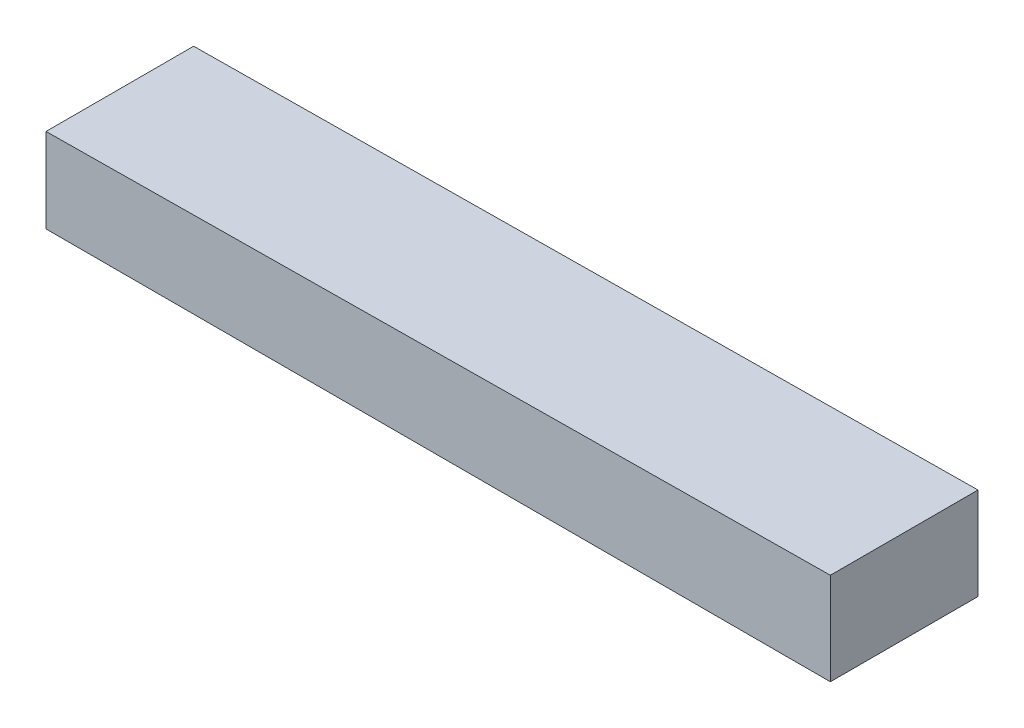
ISO-10303-21;
HEADER;
FILE_DESCRIPTION(('STEP AP214'),'2;1');
FILE_NAME('part.step','',(''),(''),'','','');
FILE_SCHEMA(('AUTOMOTIVE_DESIGN { 1 0 10303 214 1 1 1 1 }'));
ENDSEC;
DATA;
#1=APPLICATION_CONTEXT('core data for automotive mechanical design processes');
#2=APPLICATION_PROTOCOL_DEFINITION('international standard','automotive_design',2000,#1);
#3=PRODUCT_CONTEXT('',#1,'mechanical');
#4=PRODUCT('Part','Part','',(#3));
#5=PRODUCT_RELATED_PRODUCT_CATEGORY('part','',(#4));
#6=PRODUCT_DEFINITION_FORMATION('','',#4);
#7=PRODUCT_DEFINITION_CONTEXT('part definition',#1,'design');
#8=PRODUCT_DEFINITION('design','',#6,#7);
#9=PRODUCT_DEFINITION_SHAPE('','',#8);
#10=(LENGTH_UNIT() NAMED_UNIT(*) SI_UNIT(.MILLI.,.METRE.));
#11=(NAMED_UNIT(*) PLANE_ANGLE_UNIT() SI_UNIT($,.RADIAN.));
#12=(NAMED_UNIT(*) SI_UNIT($,.STERADIAN.) SOLID_ANGLE_UNIT());
#13=UNCERTAINTY_MEASURE_WITH_UNIT(LENGTH_MEASURE(1.E-05),#10,'distance_accuracy_value','');
#14=(GEOMETRIC_REPRESENTATION_CONTEXT(3) GLOBAL_UNCERTAINTY_ASSIGNED_CONTEXT((#13)) GLOBAL_UNIT_ASSIGNED_CONTEXT((#10,
#11,#12)) REPRESENTATION_CONTEXT('',''));
#15=CARTESIAN_POINT('',(0.,0.,0.));
#16=DIRECTION('',(0.,0.,1.));
#17=DIRECTION('',(1.,0.,0.));
#18=AXIS2_PLACEMENT_3D('',#15,#16,#17);
#19=CARTESIAN_POINT('',(0.,10.,16.));
#20=DIRECTION('',(-1.,0.,0.));
#21=DIRECTION('',(0.,-1.,0.));
#22=AXIS2_PLACEMENT_3D('',#19,#20,#21);
#23=PLANE('',#22);
#24=DIRECTION('',(0.,1.,0.));
#25=VECTOR('',#24,1.);
#26=CARTESIAN_POINT('',(0.,10.,0.));
#27=LINE('',#26,#25);
#28=CARTESIAN_POINT('',(0.,0.,0.));
#29=VERTEX_POINT('',#28);
#30=CARTESIAN_POINT('',(0.,10.,0.));
#31=VERTEX_POINT('',#30);
#32=EDGE_CURVE('E111',#29,#31,#27,.T.);
#33=ORIENTED_EDGE('',*,*,#32,.T.);
#34=DIRECTION('',(0.,0.,-1.));
#35=VECTOR('',#34,1.);
#36=CARTESIAN_POINT('',(0.,10.,16.));
#37=LINE('',#36,#35);
#38=CARTESIAN_POINT('',(0.,10.,16.));
#39=VERTEX_POINT('',#38);
#40=EDGE_CURVE('E11',#39,#31,#37,.T.);
#41=ORIENTED_EDGE('',*,*,#40,.F.);
#42=DIRECTION('',(0.,1.,0.));
#43=VECTOR('',#42,1.);
#44=CARTESIAN_POINT('',(0.,10.,16.));
#45=LINE('',#44,#43);
#46=CARTESIAN_POINT('',(0.,0.,16.));
#47=VERTEX_POINT('',#46);
#48=EDGE_CURVE('E95',#47,#39,#45,.T.);
#49=ORIENTED_EDGE('',*,*,#48,.F.);
#50=DIRECTION('',(0.,0.,-1.));
#51=VECTOR('',#50,1.);
#52=CARTESIAN_POINT('',(0.,0.,16.));
#53=LINE('',#52,#51);
#54=EDGE_CURVE('E107',#47,#29,#53,.T.);
#55=ORIENTED_EDGE('',*,*,#54,.T.);
#56=EDGE_LOOP('',(#33,#41,#49,#55));
#57=FACE_BOUND('',#56,.T.);
#58=ADVANCED_FACE('F43',(#57),#23,.F.);
#59=CARTESIAN_POINT('',(-85.,9.14999999999999,16.));
#60=DIRECTION('',(0.009999500037497,-0.999950003749688,0.));
#61=DIRECTION('',(0.999950003749688,0.009999500037497,0.));
#62=AXIS2_PLACEMENT_3D('',#59,#60,#61);
#63=PLANE('',#62);
#64=DIRECTION('',(-0.999950003749687,-0.009999500037497,0.));
#65=VECTOR('',#64,1.);
#66=CARTESIAN_POINT('',(-85.,9.14999999999999,0.));
#67=LINE('',#66,#65);
#68=CARTESIAN_POINT('',(-85.,9.14999999999999,0.));
#69=VERTEX_POINT('',#68);
#70=EDGE_CURVE('E100',#31,#69,#67,.T.);
#71=ORIENTED_EDGE('',*,*,#70,.T.);
#72=DIRECTION('',(0.,0.,-1.));
#73=VECTOR('',#72,1.);
#74=CARTESIAN_POINT('',(-85.,9.14999999999999,16.));
#75=LINE('',#74,#73);
#76=CARTESIAN_POINT('',(-85.,9.14999999999999,16.));
#77=VERTEX_POINT('',#76);
#78=EDGE_CURVE('E52',#77,#69,#75,.T.);
#79=ORIENTED_EDGE('',*,*,#78,.F.);
#80=DIRECTION('',(-0.999950003749687,-0.009999500037497,0.));
#81=VECTOR('',#80,1.);
#82=CARTESIAN_POINT('',(-85.,9.14999999999999,16.));
#83=LINE('',#82,#81);
#84=EDGE_CURVE('E90',#39,#77,#83,.T.);
#85=ORIENTED_EDGE('',*,*,#84,.F.);
#86=ORIENTED_EDGE('',*,*,#40,.T.);
#87=EDGE_LOOP('',(#71,#79,#85,#86));
#88=FACE_BOUND('',#87,.T.);
#89=ADVANCED_FACE('F99',(#88),#63,.F.);
#90=CARTESIAN_POINT('',(-85.,0.,16.));
#91=DIRECTION('',(1.,0.,0.));
#92=DIRECTION('',(0.,0.,-1.));
#93=AXIS2_PLACEMENT_3D('',#90,#91,#92);
#94=PLANE('',#93);
#95=DIRECTION('',(0.,-1.,0.));
#96=VECTOR('',#95,1.);
#97=CARTESIAN_POINT('',(-85.,0.,0.));
#98=LINE('',#97,#96);
#99=CARTESIAN_POINT('',(-85.,0.,0.));
#100=VERTEX_POINT('',#99);
#101=EDGE_CURVE('E77',#69,#100,#98,.T.);
#102=ORIENTED_EDGE('',*,*,#101,.T.);
#103=DIRECTION('',(0.,0.,-1.));
#104=VECTOR('',#103,1.);
#105=CARTESIAN_POINT('',(-85.,0.,16.));
#106=LINE('',#105,#104);
#107=CARTESIAN_POINT('',(-85.,0.,16.));
#108=VERTEX_POINT('',#107);
#109=EDGE_CURVE('E102',#108,#100,#106,.T.);
#110=ORIENTED_EDGE('',*,*,#109,.F.);
#111=DIRECTION('',(0.,-1.,0.));
#112=VECTOR('',#111,1.);
#113=CARTESIAN_POINT('',(-85.,0.,16.));
#114=LINE('',#113,#112);
#115=EDGE_CURVE('E93',#77,#108,#114,.T.);
#116=ORIENTED_EDGE('',*,*,#115,.F.);
#117=ORIENTED_EDGE('',*,*,#78,.T.);
#118=EDGE_LOOP('',(#102,#110,#116,#117));
#119=FACE_BOUND('',#118,.T.);
#120=ADVANCED_FACE('F103',(#119),#94,.F.);
#121=CARTESIAN_POINT('',(0.,0.,16.));
#122=DIRECTION('',(0.,1.,0.));
#123=DIRECTION('',(0.,0.,1.));
#124=AXIS2_PLACEMENT_3D('',#121,#122,#123);
#125=PLANE('',#124);
#126=DIRECTION('',(1.,0.,0.));
#127=VECTOR('',#126,1.);
#128=CARTESIAN_POINT('',(0.,0.,0.));
#129=LINE('',#128,#127);
#130=EDGE_CURVE('E83',#100,#29,#129,.T.);
#131=ORIENTED_EDGE('',*,*,#130,.T.);
#132=ORIENTED_EDGE('',*,*,#54,.F.);
#133=DIRECTION('',(1.,0.,0.));
#134=VECTOR('',#133,1.);
#135=CARTESIAN_POINT('',(0.,0.,16.));
#136=LINE('',#135,#134);
#137=EDGE_CURVE('E60',#108,#47,#136,.T.);
#138=ORIENTED_EDGE('',*,*,#137,.F.);
#139=ORIENTED_EDGE('',*,*,#109,.T.);
#140=EDGE_LOOP('',(#131,#132,#138,#139));
#141=FACE_BOUND('',#140,.T.);
#142=ADVANCED_FACE('F124',(#141),#125,.F.);
#143=CARTESIAN_POINT('',(0.,0.,16.));
#144=DIRECTION('',(0.,0.,-1.));
#145=DIRECTION('',(-1.,0.,0.));
#146=AXIS2_PLACEMENT_3D('',#143,#144,#145);
#147=PLANE('',#146);
#148=ORIENTED_EDGE('',*,*,#48,.T.);
#149=ORIENTED_EDGE('',*,*,#84,.T.);
#150=ORIENTED_EDGE('',*,*,#115,.T.);
#151=ORIENTED_EDGE('',*,*,#137,.T.);
#152=EDGE_LOOP('',(#148,#149,#150,#151));
#153=FACE_BOUND('',#152,.T.);
#154=ADVANCED_FACE('F91',(#153),#147,.F.);
#155=CARTESIAN_POINT('',(0.,0.,0.));
#156=DIRECTION('',(0.,0.,-1.));
#157=DIRECTION('',(-1.,0.,0.));
#158=AXIS2_PLACEMENT_3D('',#155,#156,#157);
#159=PLANE('',#158);
#160=ORIENTED_EDGE('',*,*,#32,.F.);
#161=ORIENTED_EDGE('',*,*,#130,.F.);
#162=ORIENTED_EDGE('',*,*,#101,.F.);
#163=ORIENTED_EDGE('',*,*,#70,.F.);
#164=EDGE_LOOP('',(#160,#161,#162,#163));
#165=FACE_BOUND('',#164,.T.);
#166=ADVANCED_FACE('F127',(#165),#159,.T.);
#167=CLOSED_SHELL('',(#58,#89,#120,#142,#154,#166));
#168=MANIFOLD_SOLID_BREP('B2',#167);
#169=ADVANCED_BREP_SHAPE_REPRESENTATION('',(#18,#168),#14);
#170=SHAPE_DEFINITION_REPRESENTATION(#9,#169);
ENDSEC;
END-ISO-10303-21;
